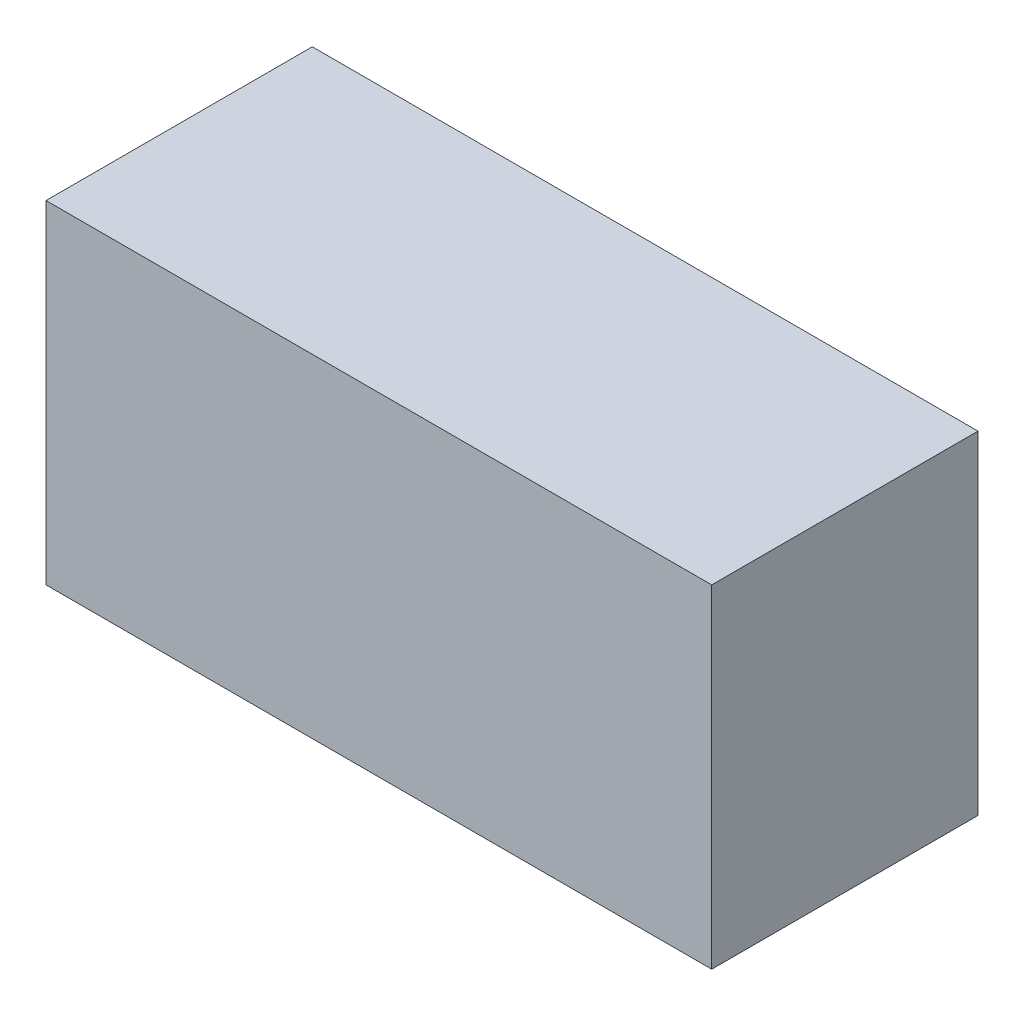
ISO-10303-21;
HEADER;
FILE_DESCRIPTION(('STEP AP214'),'2;1');
FILE_NAME('part.step','',(''),(''),'','','');
FILE_SCHEMA(('AUTOMOTIVE_DESIGN { 1 0 10303 214 1 1 1 1 }'));
ENDSEC;
DATA;
#1=APPLICATION_CONTEXT('core data for automotive mechanical design processes');
#2=APPLICATION_PROTOCOL_DEFINITION('international standard','automotive_design',2000,#1);
#3=PRODUCT_CONTEXT('',#1,'mechanical');
#4=PRODUCT('Part','Part','',(#3));
#5=PRODUCT_RELATED_PRODUCT_CATEGORY('part','',(#4));
#6=PRODUCT_DEFINITION_FORMATION('','',#4);
#7=PRODUCT_DEFINITION_CONTEXT('part definition',#1,'design');
#8=PRODUCT_DEFINITION('design','',#6,#7);
#9=PRODUCT_DEFINITION_SHAPE('','',#8);
#10=(LENGTH_UNIT() NAMED_UNIT(*) SI_UNIT(.MILLI.,.METRE.));
#11=(NAMED_UNIT(*) PLANE_ANGLE_UNIT() SI_UNIT($,.RADIAN.));
#12=(NAMED_UNIT(*) SI_UNIT($,.STERADIAN.) SOLID_ANGLE_UNIT());
#13=UNCERTAINTY_MEASURE_WITH_UNIT(LENGTH_MEASURE(1.E-05),#10,'distance_accuracy_value','');
#14=(GEOMETRIC_REPRESENTATION_CONTEXT(3) GLOBAL_UNCERTAINTY_ASSIGNED_CONTEXT((#13)) GLOBAL_UNIT_ASSIGNED_CONTEXT((#10,
#11,#12)) REPRESENTATION_CONTEXT('',''));
#15=CARTESIAN_POINT('',(0.,0.,0.));
#16=DIRECTION('',(0.,0.,1.));
#17=DIRECTION('',(1.,0.,0.));
#18=AXIS2_PLACEMENT_3D('',#15,#16,#17);
#19=CARTESIAN_POINT('',(0.,0.,10.16));
#20=DIRECTION('',(1.,0.,0.));
#21=DIRECTION('',(0.,1.,0.));
#22=AXIS2_PLACEMENT_3D('',#19,#20,#21);
#23=PLANE('',#22);
#24=DIRECTION('',(0.,-1.,0.));
#25=VECTOR('',#24,1.);
#26=CARTESIAN_POINT('',(0.,0.,0.));
#27=LINE('',#26,#25);
#28=CARTESIAN_POINT('',(0.,0.,0.));
#29=VERTEX_POINT('',#28);
#30=CARTESIAN_POINT('',(0.,-12.7,0.));
#31=VERTEX_POINT('',#30);
#32=EDGE_CURVE('E290',#29,#31,#27,.T.);
#33=ORIENTED_EDGE('',*,*,#32,.T.);
#34=DIRECTION('',(0.,0.,-1.));
#35=VECTOR('',#34,1.);
#36=CARTESIAN_POINT('',(0.,-12.7,10.16));
#37=LINE('',#36,#35);
#38=CARTESIAN_POINT('',(0.,-12.7,10.16));
#39=VERTEX_POINT('',#38);
#40=EDGE_CURVE('E11',#39,#31,#37,.T.);
#41=ORIENTED_EDGE('',*,*,#40,.F.);
#42=DIRECTION('',(0.,-1.,0.));
#43=VECTOR('',#42,1.);
#44=CARTESIAN_POINT('',(0.,0.,10.16));
#45=LINE('',#44,#43);
#46=CARTESIAN_POINT('',(0.,0.,10.16));
#47=VERTEX_POINT('',#46);
#48=EDGE_CURVE('E291',#47,#39,#45,.T.);
#49=ORIENTED_EDGE('',*,*,#48,.F.);
#50=DIRECTION('',(0.,0.,-1.));
#51=VECTOR('',#50,1.);
#52=CARTESIAN_POINT('',(0.,0.,10.16));
#53=LINE('',#52,#51);
#54=EDGE_CURVE('E305',#47,#29,#53,.T.);
#55=ORIENTED_EDGE('',*,*,#54,.T.);
#56=EDGE_LOOP('',(#33,#41,#49,#55));
#57=FACE_BOUND('',#56,.T.);
#58=DIRECTION('',(0.,-0.499999999999997,-0.86602540378444));
#59=VECTOR('',#58,1.);
#60=CARTESIAN_POINT('',(0.,-4.55332949547903,1.96807540170928));
#61=LINE('',#60,#59);
#62=CARTESIAN_POINT('',(0.,-2.75665899095808,5.08));
#63=VERTEX_POINT('',#62);
#64=CARTESIAN_POINT('',(0.,-4.55332949547903,1.96807540170927));
#65=VERTEX_POINT('',#64);
#66=EDGE_CURVE('E174',#63,#65,#61,.T.);
#67=ORIENTED_EDGE('',*,*,#66,.F.);
#68=DIRECTION('',(0.,0.499999999999998,-0.86602540378444));
#69=VECTOR('',#68,1.);
#70=CARTESIAN_POINT('',(0.,-2.75665899095808,5.08));
#71=LINE('',#70,#69);
#72=CARTESIAN_POINT('',(0.,-4.55332949547903,8.19192459829072));
#73=VERTEX_POINT('',#72);
#74=EDGE_CURVE('E234',#73,#63,#71,.T.);
#75=ORIENTED_EDGE('',*,*,#74,.F.);
#76=DIRECTION('',(0.,1.,0.));
#77=VECTOR('',#76,1.);
#78=CARTESIAN_POINT('',(0.,-4.55332949547903,8.19192459829072));
#79=LINE('',#78,#77);
#80=CARTESIAN_POINT('',(0.,-8.14667050452097,8.19192459829072));
#81=VERTEX_POINT('',#80);
#82=EDGE_CURVE('E261',#81,#73,#79,.T.);
#83=ORIENTED_EDGE('',*,*,#82,.F.);
#84=DIRECTION('',(0.,0.499999999999997,0.86602540378444));
#85=VECTOR('',#84,1.);
#86=CARTESIAN_POINT('',(0.,-8.14667050452097,8.19192459829072));
#87=LINE('',#86,#85);
#88=CARTESIAN_POINT('',(0.,-9.94334100904192,5.08));
#89=VERTEX_POINT('',#88);
#90=EDGE_CURVE('E257',#89,#81,#87,.T.);
#91=ORIENTED_EDGE('',*,*,#90,.F.);
#92=DIRECTION('',(0.,-0.499999999999998,0.86602540378444));
#93=VECTOR('',#92,1.);
#94=CARTESIAN_POINT('',(0.,-9.94334100904192,5.08));
#95=LINE('',#94,#93);
#96=CARTESIAN_POINT('',(0.,-8.14667050452096,1.96807540170928));
#97=VERTEX_POINT('',#96);
#98=EDGE_CURVE('E62',#97,#89,#95,.T.);
#99=ORIENTED_EDGE('',*,*,#98,.F.);
#100=DIRECTION('',(0.,-1.,0.));
#101=VECTOR('',#100,1.);
#102=CARTESIAN_POINT('',(0.,-8.14667050452096,1.96807540170928));
#103=LINE('',#102,#101);
#104=EDGE_CURVE('E57',#65,#97,#103,.T.);
#105=ORIENTED_EDGE('',*,*,#104,.F.);
#106=EDGE_LOOP('',(#67,#75,#83,#91,#99,#105));
#107=FACE_BOUND('',#106,.T.);
#108=ADVANCED_FACE('F41',(#57,#107),#23,.F.);
#109=CARTESIAN_POINT('',(0.,-12.7,10.16));
#110=DIRECTION('',(0.,1.,0.));
#111=DIRECTION('',(0.,0.,1.));
#112=AXIS2_PLACEMENT_3D('',#109,#110,#111);
#113=PLANE('',#112);
#114=DIRECTION('',(1.,0.,0.));
#115=VECTOR('',#114,1.);
#116=CARTESIAN_POINT('',(0.,-12.7,0.));
#117=LINE('',#116,#115);
#118=CARTESIAN_POINT('',(25.4,-12.7,0.));
#119=VERTEX_POINT('',#118);
#120=EDGE_CURVE('E309',#31,#119,#117,.T.);
#121=ORIENTED_EDGE('',*,*,#120,.T.);
#122=DIRECTION('',(0.,0.,-1.));
#123=VECTOR('',#122,1.);
#124=CARTESIAN_POINT('',(25.4,-12.7,10.16));
#125=LINE('',#124,#123);
#126=CARTESIAN_POINT('',(25.4,-12.7,10.16));
#127=VERTEX_POINT('',#126);
#128=EDGE_CURVE('E50',#127,#119,#125,.T.);
#129=ORIENTED_EDGE('',*,*,#128,.F.);
#130=DIRECTION('',(1.,0.,0.));
#131=VECTOR('',#130,1.);
#132=CARTESIAN_POINT('',(0.,-12.7,10.16));
#133=LINE('',#132,#131);
#134=EDGE_CURVE('E295',#39,#127,#133,.T.);
#135=ORIENTED_EDGE('',*,*,#134,.F.);
#136=ORIENTED_EDGE('',*,*,#40,.T.);
#137=EDGE_LOOP('',(#121,#129,#135,#136));
#138=FACE_BOUND('',#137,.T.);
#139=ADVANCED_FACE('F345',(#138),#113,.F.);
#140=CARTESIAN_POINT('',(25.4,0.,10.16));
#141=DIRECTION('',(-1.,0.,0.));
#142=DIRECTION('',(0.,0.,1.));
#143=AXIS2_PLACEMENT_3D('',#140,#141,#142);
#144=PLANE('',#143);
#145=DIRECTION('',(0.,1.,0.));
#146=VECTOR('',#145,1.);
#147=CARTESIAN_POINT('',(25.4,0.,0.));
#148=LINE('',#147,#146);
#149=CARTESIAN_POINT('',(25.4,0.,0.));
#150=VERTEX_POINT('',#149);
#151=EDGE_CURVE('E312',#119,#150,#148,.T.);
#152=ORIENTED_EDGE('',*,*,#151,.T.);
#153=DIRECTION('',(0.,0.,-1.));
#154=VECTOR('',#153,1.);
#155=CARTESIAN_POINT('',(25.4,0.,10.16));
#156=LINE('',#155,#154);
#157=CARTESIAN_POINT('',(25.4,0.,10.16));
#158=VERTEX_POINT('',#157);
#159=EDGE_CURVE('E320',#158,#150,#156,.T.);
#160=ORIENTED_EDGE('',*,*,#159,.F.);
#161=DIRECTION('',(0.,1.,0.));
#162=VECTOR('',#161,1.);
#163=CARTESIAN_POINT('',(25.4,0.,10.16));
#164=LINE('',#163,#162);
#165=EDGE_CURVE('E299',#127,#158,#164,.T.);
#166=ORIENTED_EDGE('',*,*,#165,.F.);
#167=ORIENTED_EDGE('',*,*,#128,.T.);
#168=EDGE_LOOP('',(#152,#160,#166,#167));
#169=FACE_BOUND('',#168,.T.);
#170=ADVANCED_FACE('F329',(#169),#144,.F.);
#171=CARTESIAN_POINT('',(0.,0.,10.16));
#172=DIRECTION('',(0.,-1.,0.));
#173=DIRECTION('',(0.,0.,-1.));
#174=AXIS2_PLACEMENT_3D('',#171,#172,#173);
#175=PLANE('',#174);
#176=DIRECTION('',(-1.,0.,0.));
#177=VECTOR('',#176,1.);
#178=CARTESIAN_POINT('',(0.,0.,0.));
#179=LINE('',#178,#177);
#180=EDGE_CURVE('E296',#150,#29,#179,.T.);
#181=ORIENTED_EDGE('',*,*,#180,.T.);
#182=ORIENTED_EDGE('',*,*,#54,.F.);
#183=DIRECTION('',(-1.,0.,0.));
#184=VECTOR('',#183,1.);
#185=CARTESIAN_POINT('',(0.,0.,10.16));
#186=LINE('',#185,#184);
#187=EDGE_CURVE('E302',#158,#47,#186,.T.);
#188=ORIENTED_EDGE('',*,*,#187,.F.);
#189=ORIENTED_EDGE('',*,*,#159,.T.);
#190=EDGE_LOOP('',(#181,#182,#188,#189));
#191=FACE_BOUND('',#190,.T.);
#192=ADVANCED_FACE('F338',(#191),#175,.F.);
#193=CARTESIAN_POINT('',(0.,0.,10.16));
#194=DIRECTION('',(0.,0.,1.));
#195=DIRECTION('',(1.,0.,0.));
#196=AXIS2_PLACEMENT_3D('',#193,#194,#195);
#197=PLANE('',#196);
#198=ORIENTED_EDGE('',*,*,#48,.T.);
#199=ORIENTED_EDGE('',*,*,#134,.T.);
#200=ORIENTED_EDGE('',*,*,#165,.T.);
#201=ORIENTED_EDGE('',*,*,#187,.T.);
#202=EDGE_LOOP('',(#198,#199,#200,#201));
#203=FACE_BOUND('',#202,.T.);
#204=ADVANCED_FACE('F344',(#203),#197,.T.);
#205=CARTESIAN_POINT('',(0.,0.,0.));
#206=DIRECTION('',(0.,0.,1.));
#207=DIRECTION('',(1.,0.,0.));
#208=AXIS2_PLACEMENT_3D('',#205,#206,#207);
#209=PLANE('',#208);
#210=ORIENTED_EDGE('',*,*,#32,.F.);
#211=ORIENTED_EDGE('',*,*,#180,.F.);
#212=ORIENTED_EDGE('',*,*,#151,.F.);
#213=ORIENTED_EDGE('',*,*,#120,.F.);
#214=EDGE_LOOP('',(#210,#211,#212,#213));
#215=FACE_BOUND('',#214,.T.);
#216=ADVANCED_FACE('F335',(#215),#209,.F.);
#217=CARTESIAN_POINT('',(-1.27,0.,0.));
#218=DIRECTION('',(1.,0.,0.));
#219=DIRECTION('',(0.,1.,0.));
#220=AXIS2_PLACEMENT_3D('',#217,#218,#219);
#221=PLANE('',#220);
#222=DIRECTION('',(0.,-0.499999999999997,-0.86602540378444));
#223=VECTOR('',#222,1.);
#224=CARTESIAN_POINT('',(-1.27,-4.55332949547903,1.96807540170928));
#225=LINE('',#224,#223);
#226=CARTESIAN_POINT('',(-1.27,-2.75665899095808,5.08));
#227=VERTEX_POINT('',#226);
#228=CARTESIAN_POINT('',(-1.27,-4.55332949547903,1.96807540170928));
#229=VERTEX_POINT('',#228);
#230=EDGE_CURVE('E229',#227,#229,#225,.T.);
#231=ORIENTED_EDGE('',*,*,#230,.T.);
#232=DIRECTION('',(0.,-1.,0.));
#233=VECTOR('',#232,1.);
#234=CARTESIAN_POINT('',(-1.27,-8.14667050452096,1.96807540170928));
#235=LINE('',#234,#233);
#236=CARTESIAN_POINT('',(-1.27,-8.14667050452096,1.96807540170928));
#237=VERTEX_POINT('',#236);
#238=EDGE_CURVE('E233',#229,#237,#235,.T.);
#239=ORIENTED_EDGE('',*,*,#238,.T.);
#240=DIRECTION('',(0.,-0.499999999999998,0.86602540378444));
#241=VECTOR('',#240,1.);
#242=CARTESIAN_POINT('',(-1.27,-9.94334100904192,5.08));
#243=LINE('',#242,#241);
#244=CARTESIAN_POINT('',(-1.27,-9.94334100904192,5.08));
#245=VERTEX_POINT('',#244);
#246=EDGE_CURVE('E237',#237,#245,#243,.T.);
#247=ORIENTED_EDGE('',*,*,#246,.T.);
#248=DIRECTION('',(0.,0.499999999999997,0.86602540378444));
#249=VECTOR('',#248,1.);
#250=CARTESIAN_POINT('',(-1.27,-8.14667050452097,8.19192459829072));
#251=LINE('',#250,#249);
#252=CARTESIAN_POINT('',(-1.27,-8.14667050452097,8.19192459829072));
#253=VERTEX_POINT('',#252);
#254=EDGE_CURVE('E240',#245,#253,#251,.T.);
#255=ORIENTED_EDGE('',*,*,#254,.T.);
#256=DIRECTION('',(0.,1.,0.));
#257=VECTOR('',#256,1.);
#258=CARTESIAN_POINT('',(-1.27,-4.55332949547903,8.19192459829072));
#259=LINE('',#258,#257);
#260=CARTESIAN_POINT('',(-1.27,-4.55332949547903,8.19192459829072));
#261=VERTEX_POINT('',#260);
#262=EDGE_CURVE('E243',#253,#261,#259,.T.);
#263=ORIENTED_EDGE('',*,*,#262,.T.);
#264=DIRECTION('',(0.,0.499999999999998,-0.86602540378444));
#265=VECTOR('',#264,1.);
#266=CARTESIAN_POINT('',(-1.27,-2.75665899095808,5.08));
#267=LINE('',#266,#265);
#268=EDGE_CURVE('E246',#261,#227,#267,.T.);
#269=ORIENTED_EDGE('',*,*,#268,.T.);
#270=EDGE_LOOP('',(#231,#239,#247,#255,#263,#269));
#271=FACE_BOUND('',#270,.T.);
#272=DIRECTION('',(0.,0.499999999999998,-0.86602540378444));
#273=VECTOR('',#272,1.);
#274=CARTESIAN_POINT('',(-1.27,-3.63654080120306,5.08));
#275=LINE('',#274,#273);
#276=CARTESIAN_POINT('',(-1.27,-4.99327040060153,7.42992459829072));
#277=VERTEX_POINT('',#276);
#278=CARTESIAN_POINT('',(-1.27,-3.63654080120306,5.08));
#279=VERTEX_POINT('',#278);
#280=EDGE_CURVE('E154',#277,#279,#275,.T.);
#281=ORIENTED_EDGE('',*,*,#280,.F.);
#282=DIRECTION('',(0.,1.,0.));
#283=VECTOR('',#282,1.);
#284=CARTESIAN_POINT('',(-1.27,-4.99327040060153,7.42992459829072));
#285=LINE('',#284,#283);
#286=CARTESIAN_POINT('',(-1.27,-7.70672959939847,7.42992459829072));
#287=VERTEX_POINT('',#286);
#288=EDGE_CURVE('E193',#287,#277,#285,.T.);
#289=ORIENTED_EDGE('',*,*,#288,.F.);
#290=DIRECTION('',(0.,0.499999999999996,0.866025403784441));
#291=VECTOR('',#290,1.);
#292=CARTESIAN_POINT('',(-1.27,-7.70672959939847,7.42992459829072));
#293=LINE('',#292,#291);
#294=CARTESIAN_POINT('',(-1.27,-9.06345919879693,5.08));
#295=VERTEX_POINT('',#294);
#296=EDGE_CURVE('E189',#295,#287,#293,.T.);
#297=ORIENTED_EDGE('',*,*,#296,.F.);
#298=DIRECTION('',(0.,-0.499999999999998,0.86602540378444));
#299=VECTOR('',#298,1.);
#300=CARTESIAN_POINT('',(-1.27,-9.06345919879693,5.08));
#301=LINE('',#300,#299);
#302=CARTESIAN_POINT('',(-1.27,-7.70672959939847,2.73007540170928));
#303=VERTEX_POINT('',#302);
#304=EDGE_CURVE('E184',#303,#295,#301,.T.);
#305=ORIENTED_EDGE('',*,*,#304,.F.);
#306=DIRECTION('',(0.,-1.,0.));
#307=VECTOR('',#306,1.);
#308=CARTESIAN_POINT('',(-1.27,-7.70672959939847,2.73007540170928));
#309=LINE('',#308,#307);
#310=CARTESIAN_POINT('',(-1.27,-4.99327040060153,2.73007540170928));
#311=VERTEX_POINT('',#310);
#312=EDGE_CURVE('E180',#311,#303,#309,.T.);
#313=ORIENTED_EDGE('',*,*,#312,.F.);
#314=DIRECTION('',(0.,-0.499999999999997,-0.866025403784441));
#315=VECTOR('',#314,1.);
#316=CARTESIAN_POINT('',(-1.27,-4.99327040060153,2.73007540170928));
#317=LINE('',#316,#315);
#318=EDGE_CURVE('E165',#279,#311,#317,.T.);
#319=ORIENTED_EDGE('',*,*,#318,.F.);
#320=EDGE_LOOP('',(#281,#289,#297,#305,#313,#319));
#321=FACE_BOUND('',#320,.T.);
#322=ADVANCED_FACE('F178',(#271,#321),#221,.F.);
#323=CARTESIAN_POINT('',(-1.27,-4.55332949547903,1.96807540170928));
#324=DIRECTION('',(0.,-0.86602540378444,0.499999999999997));
#325=DIRECTION('',(0.,-0.499999999999997,-0.86602540378444));
#326=AXIS2_PLACEMENT_3D('',#323,#324,#325);
#327=PLANE('',#326);
#328=ORIENTED_EDGE('',*,*,#66,.T.);
#329=DIRECTION('',(1.,0.,0.));
#330=VECTOR('',#329,1.);
#331=CARTESIAN_POINT('',(-1.27,-4.55332949547903,1.96807540170928));
#332=LINE('',#331,#330);
#333=EDGE_CURVE('E287',#229,#65,#332,.T.);
#334=ORIENTED_EDGE('',*,*,#333,.F.);
#335=ORIENTED_EDGE('',*,*,#230,.F.);
#336=DIRECTION('',(1.,0.,0.));
#337=VECTOR('',#336,1.);
#338=CARTESIAN_POINT('',(-1.27,-2.75665899095808,5.08));
#339=LINE('',#338,#337);
#340=EDGE_CURVE('E249',#227,#63,#339,.T.);
#341=ORIENTED_EDGE('',*,*,#340,.T.);
#342=EDGE_LOOP('',(#328,#334,#335,#341));
#343=FACE_BOUND('',#342,.T.);
#344=ADVANCED_FACE('F359',(#343),#327,.F.);
#345=CARTESIAN_POINT('',(-1.27,-8.14667050452096,1.96807540170928));
#346=DIRECTION('',(0.,0.,1.));
#347=DIRECTION('',(1.,0.,0.));
#348=AXIS2_PLACEMENT_3D('',#345,#346,#347);
#349=PLANE('',#348);
#350=ORIENTED_EDGE('',*,*,#104,.T.);
#351=DIRECTION('',(1.,0.,0.));
#352=VECTOR('',#351,1.);
#353=CARTESIAN_POINT('',(-1.27,-8.14667050452096,1.96807540170928));
#354=LINE('',#353,#352);
#355=EDGE_CURVE('E283',#237,#97,#354,.T.);
#356=ORIENTED_EDGE('',*,*,#355,.F.);
#357=ORIENTED_EDGE('',*,*,#238,.F.);
#358=ORIENTED_EDGE('',*,*,#333,.T.);
#359=EDGE_LOOP('',(#350,#356,#357,#358));
#360=FACE_BOUND('',#359,.T.);
#361=ADVANCED_FACE('F362',(#360),#349,.F.);
#362=CARTESIAN_POINT('',(-1.27,-9.94334100904192,5.08));
#363=DIRECTION('',(0.,0.86602540378444,0.499999999999998));
#364=DIRECTION('',(0.,-0.499999999999998,0.86602540378444));
#365=AXIS2_PLACEMENT_3D('',#362,#363,#364);
#366=PLANE('',#365);
#367=ORIENTED_EDGE('',*,*,#98,.T.);
#368=DIRECTION('',(1.,0.,0.));
#369=VECTOR('',#368,1.);
#370=CARTESIAN_POINT('',(-1.27,-9.94334100904192,5.08));
#371=LINE('',#370,#369);
#372=EDGE_CURVE('E279',#245,#89,#371,.T.);
#373=ORIENTED_EDGE('',*,*,#372,.F.);
#374=ORIENTED_EDGE('',*,*,#246,.F.);
#375=ORIENTED_EDGE('',*,*,#355,.T.);
#376=EDGE_LOOP('',(#367,#373,#374,#375));
#377=FACE_BOUND('',#376,.T.);
#378=ADVANCED_FACE('F366',(#377),#366,.F.);
#379=CARTESIAN_POINT('',(-1.27,-8.14667050452097,8.19192459829072));
#380=DIRECTION('',(0.,0.86602540378444,-0.499999999999997));
#381=DIRECTION('',(0.,0.499999999999997,0.86602540378444));
#382=AXIS2_PLACEMENT_3D('',#379,#380,#381);
#383=PLANE('',#382);
#384=ORIENTED_EDGE('',*,*,#90,.T.);
#385=DIRECTION('',(1.,0.,0.));
#386=VECTOR('',#385,1.);
#387=CARTESIAN_POINT('',(-1.27,-8.14667050452097,8.19192459829072));
#388=LINE('',#387,#386);
#389=EDGE_CURVE('E275',#253,#81,#388,.T.);
#390=ORIENTED_EDGE('',*,*,#389,.F.);
#391=ORIENTED_EDGE('',*,*,#254,.F.);
#392=ORIENTED_EDGE('',*,*,#372,.T.);
#393=EDGE_LOOP('',(#384,#390,#391,#392));
#394=FACE_BOUND('',#393,.T.);
#395=ADVANCED_FACE('F370',(#394),#383,.F.);
#396=CARTESIAN_POINT('',(-1.27,-4.55332949547903,8.19192459829072));
#397=DIRECTION('',(0.,0.,-1.));
#398=DIRECTION('',(-1.,0.,0.));
#399=AXIS2_PLACEMENT_3D('',#396,#397,#398);
#400=PLANE('',#399);
#401=ORIENTED_EDGE('',*,*,#82,.T.);
#402=DIRECTION('',(1.,0.,0.));
#403=VECTOR('',#402,1.);
#404=CARTESIAN_POINT('',(-1.27,-4.55332949547903,8.19192459829072));
#405=LINE('',#404,#403);
#406=EDGE_CURVE('E271',#261,#73,#405,.T.);
#407=ORIENTED_EDGE('',*,*,#406,.F.);
#408=ORIENTED_EDGE('',*,*,#262,.F.);
#409=ORIENTED_EDGE('',*,*,#389,.T.);
#410=EDGE_LOOP('',(#401,#407,#408,#409));
#411=FACE_BOUND('',#410,.T.);
#412=ADVANCED_FACE('F374',(#411),#400,.F.);
#413=CARTESIAN_POINT('',(-1.27,-2.75665899095808,5.08));
#414=DIRECTION('',(0.,-0.86602540378444,-0.499999999999998));
#415=DIRECTION('',(0.,0.499999999999998,-0.86602540378444));
#416=AXIS2_PLACEMENT_3D('',#413,#414,#415);
#417=PLANE('',#416);
#418=ORIENTED_EDGE('',*,*,#74,.T.);
#419=ORIENTED_EDGE('',*,*,#340,.F.);
#420=ORIENTED_EDGE('',*,*,#268,.F.);
#421=ORIENTED_EDGE('',*,*,#406,.T.);
#422=EDGE_LOOP('',(#418,#419,#420,#421));
#423=FACE_BOUND('',#422,.T.);
#424=ADVANCED_FACE('F378',(#423),#417,.F.);
#425=CARTESIAN_POINT('',(-1.27,-3.63654080120306,5.08));
#426=DIRECTION('',(0.,-0.86602540378444,-0.499999999999998));
#427=DIRECTION('',(0.,0.499999999999998,-0.86602540378444));
#428=AXIS2_PLACEMENT_3D('',#425,#426,#427);
#429=PLANE('',#428);
#430=DIRECTION('',(0.,0.499999999999998,-0.86602540378444));
#431=VECTOR('',#430,1.);
#432=CARTESIAN_POINT('',(0.,-3.63654080120306,5.08));
#433=LINE('',#432,#431);
#434=CARTESIAN_POINT('',(0.,-4.99327040060153,7.42992459829072));
#435=VERTEX_POINT('',#434);
#436=CARTESIAN_POINT('',(0.,-3.63654080120306,5.08));
#437=VERTEX_POINT('',#436);
#438=EDGE_CURVE('E196',#435,#437,#433,.T.);
#439=ORIENTED_EDGE('',*,*,#438,.F.);
#440=DIRECTION('',(1.,0.,0.));
#441=VECTOR('',#440,1.);
#442=CARTESIAN_POINT('',(-1.27,-4.99327040060153,7.42992459829072));
#443=LINE('',#442,#441);
#444=EDGE_CURVE('E160',#277,#435,#443,.T.);
#445=ORIENTED_EDGE('',*,*,#444,.F.);
#446=ORIENTED_EDGE('',*,*,#280,.T.);
#447=DIRECTION('',(1.,0.,0.));
#448=VECTOR('',#447,1.);
#449=CARTESIAN_POINT('',(-1.27,-3.63654080120306,5.08));
#450=LINE('',#449,#448);
#451=EDGE_CURVE('E158',#279,#437,#450,.T.);
#452=ORIENTED_EDGE('',*,*,#451,.T.);
#453=EDGE_LOOP('',(#439,#445,#446,#452));
#454=FACE_BOUND('',#453,.T.);
#455=ADVANCED_FACE('F157',(#454),#429,.T.);
#456=CARTESIAN_POINT('',(-1.27,-4.99327040060153,2.73007540170928));
#457=DIRECTION('',(0.,-0.866025403784441,0.499999999999997));
#458=DIRECTION('',(0.,-0.499999999999997,-0.866025403784441));
#459=AXIS2_PLACEMENT_3D('',#456,#457,#458);
#460=PLANE('',#459);
#461=DIRECTION('',(0.,-0.499999999999997,-0.866025403784441));
#462=VECTOR('',#461,1.);
#463=CARTESIAN_POINT('',(0.,-4.99327040060153,2.73007540170928));
#464=LINE('',#463,#462);
#465=CARTESIAN_POINT('',(0.,-4.99327040060153,2.73007540170928));
#466=VERTEX_POINT('',#465);
#467=EDGE_CURVE('E172',#437,#466,#464,.T.);
#468=ORIENTED_EDGE('',*,*,#467,.F.);
#469=ORIENTED_EDGE('',*,*,#451,.F.);
#470=ORIENTED_EDGE('',*,*,#318,.T.);
#471=DIRECTION('',(1.,0.,0.));
#472=VECTOR('',#471,1.);
#473=CARTESIAN_POINT('',(-1.27,-4.99327040060153,2.73007540170928));
#474=LINE('',#473,#472);
#475=EDGE_CURVE('E175',#311,#466,#474,.T.);
#476=ORIENTED_EDGE('',*,*,#475,.T.);
#477=EDGE_LOOP('',(#468,#469,#470,#476));
#478=FACE_BOUND('',#477,.T.);
#479=ADVANCED_FACE('F169',(#478),#460,.T.);
#480=CARTESIAN_POINT('',(-1.27,-7.70672959939847,2.73007540170928));
#481=DIRECTION('',(0.,0.,1.));
#482=DIRECTION('',(1.,0.,0.));
#483=AXIS2_PLACEMENT_3D('',#480,#481,#482);
#484=PLANE('',#483);
#485=DIRECTION('',(0.,-1.,0.));
#486=VECTOR('',#485,1.);
#487=CARTESIAN_POINT('',(0.,-7.70672959939847,2.73007540170928));
#488=LINE('',#487,#486);
#489=CARTESIAN_POINT('',(0.,-7.70672959939847,2.73007540170928));
#490=VERTEX_POINT('',#489);
#491=EDGE_CURVE('E201',#466,#490,#488,.T.);
#492=ORIENTED_EDGE('',*,*,#491,.F.);
#493=ORIENTED_EDGE('',*,*,#475,.F.);
#494=ORIENTED_EDGE('',*,*,#312,.T.);
#495=DIRECTION('',(1.,0.,0.));
#496=VECTOR('',#495,1.);
#497=CARTESIAN_POINT('',(-1.27,-7.70672959939847,2.73007540170928));
#498=LINE('',#497,#496);
#499=EDGE_CURVE('E224',#303,#490,#498,.T.);
#500=ORIENTED_EDGE('',*,*,#499,.T.);
#501=EDGE_LOOP('',(#492,#493,#494,#500));
#502=FACE_BOUND('',#501,.T.);
#503=ADVANCED_FACE('F390',(#502),#484,.T.);
#504=CARTESIAN_POINT('',(-1.27,-9.06345919879693,5.08));
#505=DIRECTION('',(0.,0.86602540378444,0.499999999999998));
#506=DIRECTION('',(0.,-0.499999999999998,0.86602540378444));
#507=AXIS2_PLACEMENT_3D('',#504,#505,#506);
#508=PLANE('',#507);
#509=DIRECTION('',(0.,-0.499999999999998,0.86602540378444));
#510=VECTOR('',#509,1.);
#511=CARTESIAN_POINT('',(0.,-9.06345919879693,5.08));
#512=LINE('',#511,#510);
#513=CARTESIAN_POINT('',(0.,-9.06345919879693,5.08));
#514=VERTEX_POINT('',#513);
#515=EDGE_CURVE('E205',#490,#514,#512,.T.);
#516=ORIENTED_EDGE('',*,*,#515,.F.);
#517=ORIENTED_EDGE('',*,*,#499,.F.);
#518=ORIENTED_EDGE('',*,*,#304,.T.);
#519=DIRECTION('',(1.,0.,0.));
#520=VECTOR('',#519,1.);
#521=CARTESIAN_POINT('',(-1.27,-9.06345919879693,5.08));
#522=LINE('',#521,#520);
#523=EDGE_CURVE('E221',#295,#514,#522,.T.);
#524=ORIENTED_EDGE('',*,*,#523,.T.);
#525=EDGE_LOOP('',(#516,#517,#518,#524));
#526=FACE_BOUND('',#525,.T.);
#527=ADVANCED_FACE('F393',(#526),#508,.T.);
#528=CARTESIAN_POINT('',(-1.27,-7.70672959939847,7.42992459829072));
#529=DIRECTION('',(0.,0.866025403784441,-0.499999999999996));
#530=DIRECTION('',(0.,0.499999999999996,0.866025403784441));
#531=AXIS2_PLACEMENT_3D('',#528,#529,#530);
#532=PLANE('',#531);
#533=DIRECTION('',(0.,0.499999999999996,0.866025403784441));
#534=VECTOR('',#533,1.);
#535=CARTESIAN_POINT('',(0.,-7.70672959939847,7.42992459829072));
#536=LINE('',#535,#534);
#537=CARTESIAN_POINT('',(0.,-7.70672959939847,7.42992459829072));
#538=VERTEX_POINT('',#537);
#539=EDGE_CURVE('E209',#514,#538,#536,.T.);
#540=ORIENTED_EDGE('',*,*,#539,.F.);
#541=ORIENTED_EDGE('',*,*,#523,.F.);
#542=ORIENTED_EDGE('',*,*,#296,.T.);
#543=DIRECTION('',(1.,0.,0.));
#544=VECTOR('',#543,1.);
#545=CARTESIAN_POINT('',(-1.27,-7.70672959939847,7.42992459829072));
#546=LINE('',#545,#544);
#547=EDGE_CURVE('E218',#287,#538,#546,.T.);
#548=ORIENTED_EDGE('',*,*,#547,.T.);
#549=EDGE_LOOP('',(#540,#541,#542,#548));
#550=FACE_BOUND('',#549,.T.);
#551=ADVANCED_FACE('F397',(#550),#532,.T.);
#552=CARTESIAN_POINT('',(-1.27,-4.99327040060153,7.42992459829072));
#553=DIRECTION('',(0.,0.,-1.));
#554=DIRECTION('',(-1.,0.,0.));
#555=AXIS2_PLACEMENT_3D('',#552,#553,#554);
#556=PLANE('',#555);
#557=DIRECTION('',(0.,1.,0.));
#558=VECTOR('',#557,1.);
#559=CARTESIAN_POINT('',(0.,-4.99327040060153,7.42992459829072));
#560=LINE('',#559,#558);
#561=EDGE_CURVE('E166',#538,#435,#560,.T.);
#562=ORIENTED_EDGE('',*,*,#561,.F.);
#563=ORIENTED_EDGE('',*,*,#547,.F.);
#564=ORIENTED_EDGE('',*,*,#288,.T.);
#565=ORIENTED_EDGE('',*,*,#444,.T.);
#566=EDGE_LOOP('',(#562,#563,#564,#565));
#567=FACE_BOUND('',#566,.T.);
#568=ADVANCED_FACE('F401',(#567),#556,.T.);
#569=ORIENTED_EDGE('',*,*,#561,.T.);
#570=ORIENTED_EDGE('',*,*,#438,.T.);
#571=ORIENTED_EDGE('',*,*,#467,.T.);
#572=ORIENTED_EDGE('',*,*,#491,.T.);
#573=ORIENTED_EDGE('',*,*,#515,.T.);
#574=ORIENTED_EDGE('',*,*,#539,.T.);
#575=EDGE_LOOP('',(#569,#570,#571,#572,#573,#574));
#576=FACE_BOUND('',#575,.T.);
#577=ADVANCED_FACE('F43',(#576),#23,.F.);
#578=CLOSED_SHELL('',(#108,#139,#170,#192,#204,#216,#322,#344,#361,#378,#395,#412,#424,#455,
#479,#503,#527,#551,#568,#577));
#579=MANIFOLD_SOLID_BREP('B2',#578);
#580=ADVANCED_BREP_SHAPE_REPRESENTATION('',(#18,#579),#14);
#581=SHAPE_DEFINITION_REPRESENTATION(#9,#580);
ENDSEC;
END-ISO-10303-21;
